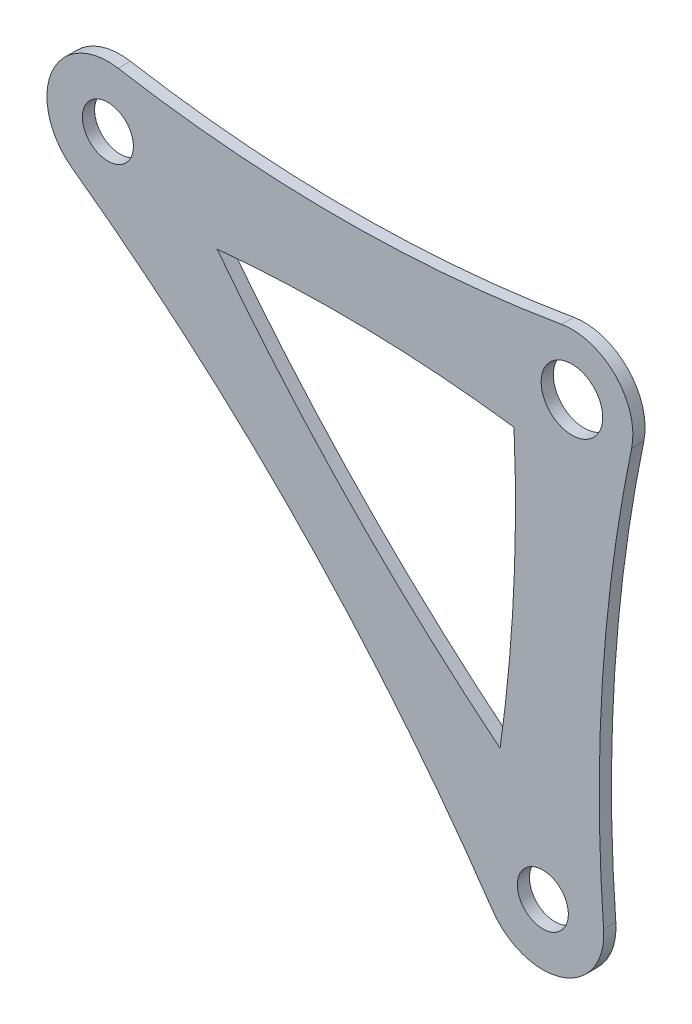
ISO-10303-21;
HEADER;
FILE_DESCRIPTION(('STEP AP214'),'2;1');
FILE_NAME('part.step','',(''),(''),'','','');
FILE_SCHEMA(('AUTOMOTIVE_DESIGN { 1 0 10303 214 1 1 1 1 }'));
ENDSEC;
DATA;
#1=APPLICATION_CONTEXT('core data for automotive mechanical design processes');
#2=APPLICATION_PROTOCOL_DEFINITION('international standard','automotive_design',2000,#1);
#3=PRODUCT_CONTEXT('',#1,'mechanical');
#4=PRODUCT('Part','Part','',(#3));
#5=PRODUCT_RELATED_PRODUCT_CATEGORY('part','',(#4));
#6=PRODUCT_DEFINITION_FORMATION('','',#4);
#7=PRODUCT_DEFINITION_CONTEXT('part definition',#1,'design');
#8=PRODUCT_DEFINITION('design','',#6,#7);
#9=PRODUCT_DEFINITION_SHAPE('','',#8);
#10=(LENGTH_UNIT() NAMED_UNIT(*) SI_UNIT(.MILLI.,.METRE.));
#11=(NAMED_UNIT(*) PLANE_ANGLE_UNIT() SI_UNIT($,.RADIAN.));
#12=(NAMED_UNIT(*) SI_UNIT($,.STERADIAN.) SOLID_ANGLE_UNIT());
#13=UNCERTAINTY_MEASURE_WITH_UNIT(LENGTH_MEASURE(1.E-05),#10,'distance_accuracy_value','');
#14=(GEOMETRIC_REPRESENTATION_CONTEXT(3) GLOBAL_UNCERTAINTY_ASSIGNED_CONTEXT((#13)) GLOBAL_UNIT_ASSIGNED_CONTEXT((#10,
#11,#12)) REPRESENTATION_CONTEXT('',''));
#15=CARTESIAN_POINT('',(0.,0.,0.));
#16=DIRECTION('',(0.,0.,1.));
#17=DIRECTION('',(1.,0.,0.));
#18=AXIS2_PLACEMENT_3D('',#15,#16,#17);
#19=CARTESIAN_POINT('',(-30.03,175.33696472792,-1.58));
#20=DIRECTION('',(0.,0.,1.));
#21=DIRECTION('',(-1.,0.,0.));
#22=AXIS2_PLACEMENT_3D('',#19,#20,#21);
#23=CYLINDRICAL_SURFACE('',#22,170.);
#24=CARTESIAN_POINT('',(-30.03,175.33696472792,0.));
#25=DIRECTION('',(0.,0.,1.));
#26=DIRECTION('',(1.,0.,0.));
#27=AXIS2_PLACEMENT_3D('',#24,#25,#26);
#28=CIRCLE('',#27,170.);
#29=CARTESIAN_POINT('',(-1.33192815785036,7.77676458318788,0.));
#30=VERTEX_POINT('',#29);
#31=CARTESIAN_POINT('',(-58.7280718421496,7.77676458318788,0.));
#32=VERTEX_POINT('',#31);
#33=EDGE_CURVE('E167',#30,#32,#28,.F.);
#34=ORIENTED_EDGE('',*,*,#33,.F.);
#35=DIRECTION('',(0.,0.,1.));
#36=VECTOR('',#35,1.);
#37=CARTESIAN_POINT('',(-1.33192815785036,7.77676458318788,-1.58));
#38=LINE('',#37,#36);
#39=CARTESIAN_POINT('',(-1.33192815785036,7.77676458318788,-1.58));
#40=VERTEX_POINT('',#39);
#41=EDGE_CURVE('E189',#40,#30,#38,.T.);
#42=ORIENTED_EDGE('',*,*,#41,.F.);
#43=CARTESIAN_POINT('',(-30.03,175.33696472792,-1.58));
#44=DIRECTION('',(0.,0.,1.));
#45=DIRECTION('',(1.,0.,0.));
#46=AXIS2_PLACEMENT_3D('',#43,#44,#45);
#47=CIRCLE('',#46,170.);
#48=CARTESIAN_POINT('',(-58.7280718421496,7.77676458318788,-1.58));
#49=VERTEX_POINT('',#48);
#50=EDGE_CURVE('E211',#40,#49,#47,.F.);
#51=ORIENTED_EDGE('',*,*,#50,.T.);
#52=DIRECTION('',(0.,0.,1.));
#53=VECTOR('',#52,1.);
#54=CARTESIAN_POINT('',(-58.7280718421496,7.77676458318788,-1.58));
#55=LINE('',#54,#53);
#56=EDGE_CURVE('E11',#49,#32,#55,.T.);
#57=ORIENTED_EDGE('',*,*,#56,.T.);
#58=EDGE_LOOP('',(#34,#42,#51,#57));
#59=FACE_BOUND('',#58,.T.);
#60=ADVANCED_FACE('F43',(#59),#23,.F.);
#61=CARTESIAN_POINT('',(-60.06,0.,-1.58));
#62=DIRECTION('',(0.,0.,1.));
#63=DIRECTION('',(-1.,0.,0.));
#64=AXIS2_PLACEMENT_3D('',#61,#62,#63);
#65=CYLINDRICAL_SURFACE('',#64,7.89);
#66=CARTESIAN_POINT('',(-60.06,0.,0.));
#67=DIRECTION('',(0.,0.,1.));
#68=DIRECTION('',(1.,0.,0.));
#69=AXIS2_PLACEMENT_3D('',#66,#67,#68);
#70=CIRCLE('',#69,7.89);
#71=CARTESIAN_POINT('',(-64.6781402375793,-6.39725571992014,0.));
#72=VERTEX_POINT('',#71);
#73=EDGE_CURVE('E169',#32,#72,#70,.T.);
#74=ORIENTED_EDGE('',*,*,#73,.F.);
#75=ORIENTED_EDGE('',*,*,#56,.F.);
#76=CARTESIAN_POINT('',(-60.06,0.,-1.58));
#77=DIRECTION('',(0.,0.,1.));
#78=DIRECTION('',(1.,0.,0.));
#79=AXIS2_PLACEMENT_3D('',#76,#77,#78);
#80=CIRCLE('',#79,7.89);
#81=CARTESIAN_POINT('',(-64.6781402375793,-6.39725571992014,-1.58));
#82=VERTEX_POINT('',#81);
#83=EDGE_CURVE('E145',#49,#82,#80,.T.);
#84=ORIENTED_EDGE('',*,*,#83,.T.);
#85=DIRECTION('',(0.,0.,1.));
#86=VECTOR('',#85,1.);
#87=CARTESIAN_POINT('',(-64.6781402375793,-6.39725571992014,-1.58));
#88=LINE('',#87,#86);
#89=EDGE_CURVE('E53',#82,#72,#88,.T.);
#90=ORIENTED_EDGE('',*,*,#89,.T.);
#91=EDGE_LOOP('',(#74,#75,#84,#90));
#92=FACE_BOUND('',#91,.T.);
#93=ADVANCED_FACE('F220',(#92),#65,.T.);
#94=CARTESIAN_POINT('',(-196.374154617217,-188.828502485704,-1.58));
#95=DIRECTION('',(0.,0.,1.));
#96=DIRECTION('',(-1.,0.,0.));
#97=AXIS2_PLACEMENT_3D('',#94,#95,#96);
#98=CYLINDRICAL_SURFACE('',#97,225.);
#99=CARTESIAN_POINT('',(-196.374154617217,-188.828502485704,0.));
#100=DIRECTION('',(0.,0.,1.));
#101=DIRECTION('',(1.,0.,0.));
#102=AXIS2_PLACEMENT_3D('',#99,#100,#101);
#103=CIRCLE('',#102,225.);
#104=CARTESIAN_POINT('',(-10.2923908909579,-62.3430202811258,0.));
#105=VERTEX_POINT('',#104);
#106=EDGE_CURVE('E172',#72,#105,#103,.F.);
#107=ORIENTED_EDGE('',*,*,#106,.F.);
#108=ORIENTED_EDGE('',*,*,#89,.F.);
#109=CARTESIAN_POINT('',(-196.374154617217,-188.828502485704,-1.58));
#110=DIRECTION('',(0.,0.,1.));
#111=DIRECTION('',(1.,0.,0.));
#112=AXIS2_PLACEMENT_3D('',#109,#110,#111);
#113=CIRCLE('',#112,225.);
#114=CARTESIAN_POINT('',(-10.2923908909579,-62.3430202811258,-1.58));
#115=VERTEX_POINT('',#114);
#116=EDGE_CURVE('E143',#82,#115,#113,.F.);
#117=ORIENTED_EDGE('',*,*,#116,.T.);
#118=DIRECTION('',(0.,0.,1.));
#119=VECTOR('',#118,1.);
#120=CARTESIAN_POINT('',(-10.2923908909579,-62.3430202811258,-1.58));
#121=LINE('',#120,#119);
#122=EDGE_CURVE('E137',#115,#105,#121,.T.);
#123=ORIENTED_EDGE('',*,*,#122,.T.);
#124=EDGE_LOOP('',(#107,#108,#117,#123));
#125=FACE_BOUND('',#124,.T.);
#126=ADVANCED_FACE('F224',(#125),#98,.F.);
#127=CARTESIAN_POINT('',(-3.76712370962372,-57.9075960384852,-1.58));
#128=DIRECTION('',(0.,0.,1.));
#129=DIRECTION('',(-1.,0.,0.));
#130=AXIS2_PLACEMENT_3D('',#127,#128,#129);
#131=CYLINDRICAL_SURFACE('',#130,7.89);
#132=CARTESIAN_POINT('',(-3.76712370962372,-57.9075960384852,0.));
#133=DIRECTION('',(0.,0.,1.));
#134=DIRECTION('',(1.,0.,0.));
#135=AXIS2_PLACEMENT_3D('',#132,#133,#134);
#136=CIRCLE('',#135,7.89);
#137=CARTESIAN_POINT('',(4.10065843107563,-57.3159000130698,0.));
#138=VERTEX_POINT('',#137);
#139=EDGE_CURVE('E175',#105,#138,#136,.T.);
#140=ORIENTED_EDGE('',*,*,#139,.F.);
#141=ORIENTED_EDGE('',*,*,#122,.F.);
#142=CARTESIAN_POINT('',(-3.76712370962372,-57.9075960384852,-1.58));
#143=DIRECTION('',(0.,0.,1.));
#144=DIRECTION('',(1.,0.,0.));
#145=AXIS2_PLACEMENT_3D('',#142,#143,#144);
#146=CIRCLE('',#145,7.89);
#147=CARTESIAN_POINT('',(4.10065843107563,-57.3159000130698,-1.58));
#148=VERTEX_POINT('',#147);
#149=EDGE_CURVE('E127',#115,#148,#146,.T.);
#150=ORIENTED_EDGE('',*,*,#149,.T.);
#151=DIRECTION('',(0.,0.,1.));
#152=VECTOR('',#151,1.);
#153=CARTESIAN_POINT('',(4.10065843107563,-57.3159000130698,-1.58));
#154=LINE('',#153,#152);
#155=EDGE_CURVE('E132',#148,#138,#154,.T.);
#156=ORIENTED_EDGE('',*,*,#155,.T.);
#157=EDGE_LOOP('',(#140,#141,#150,#156));
#158=FACE_BOUND('',#157,.T.);
#159=ADVANCED_FACE('F140',(#158),#131,.T.);
#160=CARTESIAN_POINT('',(203.537468081249,-42.317268190119,-1.58));
#161=DIRECTION('',(0.,0.,1.));
#162=DIRECTION('',(-1.,0.,0.));
#163=AXIS2_PLACEMENT_3D('',#160,#161,#162);
#164=CYLINDRICAL_SURFACE('',#163,200.);
#165=CARTESIAN_POINT('',(203.537468081249,-42.317268190119,0.));
#166=DIRECTION('',(0.,0.,1.));
#167=DIRECTION('',(1.,0.,0.));
#168=AXIS2_PLACEMENT_3D('',#165,#166,#167);
#169=CIRCLE('',#168,200.);
#170=CARTESIAN_POINT('',(7.72480938554551,-1.60605727076838,0.));
#171=VERTEX_POINT('',#170);
#172=EDGE_CURVE('E134',#138,#171,#169,.F.);
#173=ORIENTED_EDGE('',*,*,#172,.F.);
#174=ORIENTED_EDGE('',*,*,#155,.F.);
#175=CARTESIAN_POINT('',(203.537468081249,-42.317268190119,-1.58));
#176=DIRECTION('',(0.,0.,1.));
#177=DIRECTION('',(1.,0.,0.));
#178=AXIS2_PLACEMENT_3D('',#175,#176,#177);
#179=CIRCLE('',#178,200.);
#180=CARTESIAN_POINT('',(7.72480938554551,-1.60605727076838,-1.58));
#181=VERTEX_POINT('',#180);
#182=EDGE_CURVE('E122',#148,#181,#179,.F.);
#183=ORIENTED_EDGE('',*,*,#182,.T.);
#184=DIRECTION('',(0.,0.,1.));
#185=VECTOR('',#184,1.);
#186=CARTESIAN_POINT('',(7.72480938554551,-1.60605727076838,-1.58));
#187=LINE('',#186,#185);
#188=EDGE_CURVE('E138',#181,#171,#187,.T.);
#189=ORIENTED_EDGE('',*,*,#188,.T.);
#190=EDGE_LOOP('',(#173,#174,#183,#189));
#191=FACE_BOUND('',#190,.T.);
#192=ADVANCED_FACE('F133',(#191),#164,.F.);
#193=CARTESIAN_POINT('',(132.547030907594,130.920906447219,-1.58));
#194=DIRECTION('',(0.,0.,1.));
#195=DIRECTION('',(-1.,0.,0.));
#196=AXIS2_PLACEMENT_3D('',#193,#194,#195);
#197=CYLINDRICAL_SURFACE('',#196,225.);
#198=CARTESIAN_POINT('',(132.547030907594,130.920906447219,0.));
#199=DIRECTION('',(0.,0.,1.));
#200=DIRECTION('',(1.,0.,0.));
#201=AXIS2_PLACEMENT_3D('',#198,#199,#200);
#202=CIRCLE('',#201,225.);
#203=CARTESIAN_POINT('',(-45.9329006907997,-6.08242933929765,0.));
#204=VERTEX_POINT('',#203);
#205=CARTESIAN_POINT('',(-9.29524167465695,-43.7381033653376,0.));
#206=VERTEX_POINT('',#205);
#207=EDGE_CURVE('E160',#204,#206,#202,.T.);
#208=ORIENTED_EDGE('',*,*,#207,.T.);
#209=DIRECTION('',(0.,0.,1.));
#210=VECTOR('',#209,1.);
#211=CARTESIAN_POINT('',(-9.29524167465695,-43.7381033653376,-1.58));
#212=LINE('',#211,#210);
#213=CARTESIAN_POINT('',(-9.29524167465695,-43.7381033653376,-1.58));
#214=VERTEX_POINT('',#213);
#215=EDGE_CURVE('E159',#214,#206,#212,.T.);
#216=ORIENTED_EDGE('',*,*,#215,.F.);
#217=CARTESIAN_POINT('',(132.547030907594,130.920906447219,-1.58));
#218=DIRECTION('',(0.,0.,1.));
#219=DIRECTION('',(1.,0.,0.));
#220=AXIS2_PLACEMENT_3D('',#217,#218,#219);
#221=CIRCLE('',#220,225.);
#222=CARTESIAN_POINT('',(-45.9329006907997,-6.08242933929765,-1.58));
#223=VERTEX_POINT('',#222);
#224=EDGE_CURVE('E188',#223,#214,#221,.T.);
#225=ORIENTED_EDGE('',*,*,#224,.F.);
#226=DIRECTION('',(0.,0.,1.));
#227=VECTOR('',#226,1.);
#228=CARTESIAN_POINT('',(-45.9329006907997,-6.08242933929765,-1.58));
#229=LINE('',#228,#227);
#230=EDGE_CURVE('E47',#223,#204,#229,.T.);
#231=ORIENTED_EDGE('',*,*,#230,.T.);
#232=EDGE_LOOP('',(#208,#216,#225,#231));
#233=FACE_BOUND('',#232,.T.);
#234=ADVANCED_FACE('F45',(#233),#197,.F.);
#235=CARTESIAN_POINT('',(-30.03,-175.33696472792,-1.58));
#236=DIRECTION('',(0.,0.,1.));
#237=DIRECTION('',(-1.,0.,0.));
#238=AXIS2_PLACEMENT_3D('',#235,#236,#237);
#239=CYLINDRICAL_SURFACE('',#238,170.);
#240=CARTESIAN_POINT('',(-30.03,-175.33696472792,0.));
#241=DIRECTION('',(0.,0.,1.));
#242=DIRECTION('',(1.,0.,0.));
#243=AXIS2_PLACEMENT_3D('',#240,#241,#242);
#244=CIRCLE('',#243,170.);
#245=CARTESIAN_POINT('',(-7.49623434821273,-6.83702583905814,0.));
#246=VERTEX_POINT('',#245);
#247=EDGE_CURVE('E163',#246,#204,#244,.T.);
#248=ORIENTED_EDGE('',*,*,#247,.T.);
#249=ORIENTED_EDGE('',*,*,#230,.F.);
#250=CARTESIAN_POINT('',(-30.03,-175.33696472792,-1.58));
#251=DIRECTION('',(0.,0.,1.));
#252=DIRECTION('',(1.,0.,0.));
#253=AXIS2_PLACEMENT_3D('',#250,#251,#252);
#254=CIRCLE('',#253,170.);
#255=CARTESIAN_POINT('',(-7.49623434821273,-6.83702583905814,-1.58));
#256=VERTEX_POINT('',#255);
#257=EDGE_CURVE('E104',#256,#223,#254,.T.);
#258=ORIENTED_EDGE('',*,*,#257,.F.);
#259=DIRECTION('',(0.,0.,1.));
#260=VECTOR('',#259,1.);
#261=CARTESIAN_POINT('',(-7.49623434821273,-6.83702583905814,-1.58));
#262=LINE('',#261,#260);
#263=EDGE_CURVE('E196',#256,#246,#262,.T.);
#264=ORIENTED_EDGE('',*,*,#263,.T.);
#265=EDGE_LOOP('',(#248,#249,#258,#264));
#266=FACE_BOUND('',#265,.T.);
#267=ADVANCED_FACE('F249',(#266),#239,.F.);
#268=CARTESIAN_POINT('',(0.,0.,-1.58));
#269=DIRECTION('',(0.,0.,1.));
#270=DIRECTION('',(-1.,0.,0.));
#271=AXIS2_PLACEMENT_3D('',#268,#269,#270);
#272=CYLINDRICAL_SURFACE('',#271,3.985);
#273=CARTESIAN_POINT('',(0.,0.,-1.58));
#274=DIRECTION('',(0.,0.,1.));
#275=DIRECTION('',(1.,0.,0.));
#276=AXIS2_PLACEMENT_3D('',#273,#274,#275);
#277=CIRCLE('',#276,3.985);
#278=CARTESIAN_POINT('',(-3.985,0.,-1.58));
#279=VERTEX_POINT('',#278);
#280=EDGE_CURVE('E153',#279,#279,#277,.T.);
#281=CARTESIAN_POINT('',(0.,0.,0.));
#282=DIRECTION('',(0.,0.,1.));
#283=DIRECTION('',(1.,0.,0.));
#284=AXIS2_PLACEMENT_3D('',#281,#282,#283);
#285=CIRCLE('',#284,3.985);
#286=CARTESIAN_POINT('',(-3.985,0.,0.));
#287=VERTEX_POINT('',#286);
#288=EDGE_CURVE('E182',#287,#287,#285,.T.);
#289=CARTESIAN_POINT('',(-3.985,0.,-1.58));
#290=CARTESIAN_POINT('',(-3.985,0.,-1.56354166666667));
#291=CARTESIAN_POINT('',(-3.985,0.,-1.54708333333333));
#292=CARTESIAN_POINT('',(-3.985,0.,-1.51416666666667));
#293=CARTESIAN_POINT('',(-3.985,0.,-1.49770833333333));
#294=CARTESIAN_POINT('',(-3.985,0.,-1.46479166666667));
#295=CARTESIAN_POINT('',(-3.985,0.,-1.44833333333333));
#296=CARTESIAN_POINT('',(-3.985,0.,-1.41541666666667));
#297=CARTESIAN_POINT('',(-3.985,0.,-1.39895833333333));
#298=CARTESIAN_POINT('',(-3.985,0.,-1.36604166666667));
#299=CARTESIAN_POINT('',(-3.985,0.,-1.34958333333333));
#300=CARTESIAN_POINT('',(-3.985,0.,-1.31666666666667));
#301=CARTESIAN_POINT('',(-3.985,0.,-1.30020833333333));
#302=CARTESIAN_POINT('',(-3.985,0.,-1.26729166666667));
#303=CARTESIAN_POINT('',(-3.985,0.,-1.25083333333333));
#304=CARTESIAN_POINT('',(-3.985,0.,-1.21791666666667));
#305=CARTESIAN_POINT('',(-3.985,0.,-1.20145833333333));
#306=CARTESIAN_POINT('',(-3.985,0.,-1.16854166666667));
#307=CARTESIAN_POINT('',(-3.985,0.,-1.15208333333333));
#308=CARTESIAN_POINT('',(-3.985,0.,-1.11916666666667));
#309=CARTESIAN_POINT('',(-3.985,0.,-1.10270833333333));
#310=CARTESIAN_POINT('',(-3.985,0.,-1.06979166666667));
#311=CARTESIAN_POINT('',(-3.985,0.,-1.05333333333333));
#312=CARTESIAN_POINT('',(-3.985,0.,-1.02041666666667));
#313=CARTESIAN_POINT('',(-3.985,0.,-1.00395833333333));
#314=CARTESIAN_POINT('',(-3.985,0.,-0.971041666666667));
#315=CARTESIAN_POINT('',(-3.985,0.,-0.954583333333333));
#316=CARTESIAN_POINT('',(-3.985,0.,-0.921666666666667));
#317=CARTESIAN_POINT('',(-3.985,0.,-0.905208333333333));
#318=CARTESIAN_POINT('',(-3.985,0.,-0.872291666666667));
#319=CARTESIAN_POINT('',(-3.985,0.,-0.855833333333333));
#320=CARTESIAN_POINT('',(-3.985,0.,-0.822916666666667));
#321=CARTESIAN_POINT('',(-3.985,0.,-0.806458333333333));
#322=CARTESIAN_POINT('',(-3.985,0.,-0.773541666666667));
#323=CARTESIAN_POINT('',(-3.985,0.,-0.757083333333333));
#324=CARTESIAN_POINT('',(-3.985,0.,-0.724166666666667));
#325=CARTESIAN_POINT('',(-3.985,0.,-0.707708333333333));
#326=CARTESIAN_POINT('',(-3.985,0.,-0.674791666666667));
#327=CARTESIAN_POINT('',(-3.985,0.,-0.658333333333333));
#328=CARTESIAN_POINT('',(-3.985,0.,-0.625416666666667));
#329=CARTESIAN_POINT('',(-3.985,0.,-0.608958333333333));
#330=CARTESIAN_POINT('',(-3.985,0.,-0.576041666666667));
#331=CARTESIAN_POINT('',(-3.985,0.,-0.559583333333333));
#332=CARTESIAN_POINT('',(-3.985,0.,-0.526666666666667));
#333=CARTESIAN_POINT('',(-3.985,0.,-0.510208333333333));
#334=CARTESIAN_POINT('',(-3.985,0.,-0.477291666666667));
#335=CARTESIAN_POINT('',(-3.985,0.,-0.460833333333333));
#336=CARTESIAN_POINT('',(-3.985,0.,-0.427916666666667));
#337=CARTESIAN_POINT('',(-3.985,0.,-0.411458333333333));
#338=CARTESIAN_POINT('',(-3.985,0.,-0.378541666666667));
#339=CARTESIAN_POINT('',(-3.985,0.,-0.362083333333333));
#340=CARTESIAN_POINT('',(-3.985,0.,-0.329166666666667));
#341=CARTESIAN_POINT('',(-3.985,0.,-0.312708333333333));
#342=CARTESIAN_POINT('',(-3.985,0.,-0.279791666666667));
#343=CARTESIAN_POINT('',(-3.985,0.,-0.263333333333333));
#344=CARTESIAN_POINT('',(-3.985,0.,-0.230416666666667));
#345=CARTESIAN_POINT('',(-3.985,0.,-0.213958333333333));
#346=CARTESIAN_POINT('',(-3.985,0.,-0.181041666666667));
#347=CARTESIAN_POINT('',(-3.985,0.,-0.164583333333333));
#348=CARTESIAN_POINT('',(-3.985,0.,-0.131666666666667));
#349=CARTESIAN_POINT('',(-3.985,0.,-0.115208333333333));
#350=CARTESIAN_POINT('',(-3.985,0.,-0.0822916666666667));
#351=CARTESIAN_POINT('',(-3.985,0.,-0.0658333333333333));
#352=CARTESIAN_POINT('',(-3.985,0.,-0.0329166666666666));
#353=CARTESIAN_POINT('',(-3.985,0.,-0.0164583333333333));
#354=CARTESIAN_POINT('',(-3.985,0.,0.));
#355=B_SPLINE_CURVE_WITH_KNOTS('',3,(#289,#290,#291,#292,#293,#294,#295,#296,#297,#298,#299,
#300,#301,#302,#303,#304,#305,#306,#307,#308,#309,#310,#311,#312,#313,#314,#315,#316,#317,#318,
#319,#320,#321,#322,#323,#324,#325,#326,#327,#328,#329,#330,#331,#332,#333,#334,#335,#336,#337,
#338,#339,#340,#341,#342,#343,#344,#345,#346,#347,#348,#349,#350,#351,#352,#353,#354),
.UNSPECIFIED.,.F.,.F.,(4,2,2,2,2,2,2,2,2,2,2,2,2,2,2,2,2,2,2,2,2,2,2,2,2,2,2,2,2,2,2,2,4),(0.,
0.0493750000000002,0.0987500000000001,0.148125,0.1975,0.246875,0.29625,0.345625,0.395,0.444375,
0.49375,0.543125,0.5925,0.641875,0.69125,0.740625,0.79,0.839375,0.88875,0.938125,0.9875,
1.036875,1.08625,1.135625,1.185,1.234375,1.28375,1.333125,1.3825,1.431875,1.48125,1.530625,
1.58),.UNSPECIFIED.);
#356=EDGE_CURVE('BSEAM238',#279,#287,#355,.T.);
#357=ORIENTED_EDGE('',*,*,#280,.F.);
#358=ORIENTED_EDGE('',*,*,#288,.T.);
#359=ORIENTED_EDGE('',*,*,#356,.T.);
#360=ORIENTED_EDGE('',*,*,#356,.F.);
#361=EDGE_LOOP('',(#357,#359,#358,#360));
#362=FACE_BOUND('',#361,.T.);
#363=ADVANCED_FACE('F238',(#362),#272,.F.);
#364=CARTESIAN_POINT('',(-3.76712370962372,-57.9075960384852,-1.58));
#365=DIRECTION('',(0.,0.,1.));
#366=DIRECTION('',(-1.,0.,0.));
#367=AXIS2_PLACEMENT_3D('',#364,#365,#366);
#368=CYLINDRICAL_SURFACE('',#367,3.30000000000001);
#369=CARTESIAN_POINT('',(-3.76712370962372,-57.9075960384852,-1.58));
#370=DIRECTION('',(0.,0.,1.));
#371=DIRECTION('',(1.,0.,0.));
#372=AXIS2_PLACEMENT_3D('',#369,#370,#371);
#373=CIRCLE('',#372,3.30000000000001);
#374=CARTESIAN_POINT('',(-7.06712370962372,-57.9075960384852,-1.58));
#375=VERTEX_POINT('',#374);
#376=EDGE_CURVE('E150',#375,#375,#373,.T.);
#377=CARTESIAN_POINT('',(-3.76712370962372,-57.9075960384852,0.));
#378=DIRECTION('',(0.,0.,1.));
#379=DIRECTION('',(1.,0.,0.));
#380=AXIS2_PLACEMENT_3D('',#377,#378,#379);
#381=CIRCLE('',#380,3.30000000000001);
#382=CARTESIAN_POINT('',(-7.06712370962372,-57.9075960384852,0.));
#383=VERTEX_POINT('',#382);
#384=EDGE_CURVE('E179',#383,#383,#381,.T.);
#385=CARTESIAN_POINT('',(-7.06712370962372,-57.9075960384852,-1.58));
#386=CARTESIAN_POINT('',(-7.06712370962372,-57.9075960384852,-1.56354166666667));
#387=CARTESIAN_POINT('',(-7.06712370962372,-57.9075960384852,-1.54708333333333));
#388=CARTESIAN_POINT('',(-7.06712370962372,-57.9075960384852,-1.51416666666667));
#389=CARTESIAN_POINT('',(-7.06712370962372,-57.9075960384852,-1.49770833333333));
#390=CARTESIAN_POINT('',(-7.06712370962372,-57.9075960384852,-1.46479166666667));
#391=CARTESIAN_POINT('',(-7.06712370962372,-57.9075960384852,-1.44833333333333));
#392=CARTESIAN_POINT('',(-7.06712370962372,-57.9075960384852,-1.41541666666667));
#393=CARTESIAN_POINT('',(-7.06712370962372,-57.9075960384852,-1.39895833333333));
#394=CARTESIAN_POINT('',(-7.06712370962372,-57.9075960384852,-1.36604166666667));
#395=CARTESIAN_POINT('',(-7.06712370962372,-57.9075960384852,-1.34958333333333));
#396=CARTESIAN_POINT('',(-7.06712370962372,-57.9075960384852,-1.31666666666667));
#397=CARTESIAN_POINT('',(-7.06712370962372,-57.9075960384852,-1.30020833333333));
#398=CARTESIAN_POINT('',(-7.06712370962372,-57.9075960384852,-1.26729166666667));
#399=CARTESIAN_POINT('',(-7.06712370962372,-57.9075960384852,-1.25083333333333));
#400=CARTESIAN_POINT('',(-7.06712370962372,-57.9075960384852,-1.21791666666667));
#401=CARTESIAN_POINT('',(-7.06712370962372,-57.9075960384852,-1.20145833333333));
#402=CARTESIAN_POINT('',(-7.06712370962372,-57.9075960384852,-1.16854166666667));
#403=CARTESIAN_POINT('',(-7.06712370962372,-57.9075960384852,-1.15208333333333));
#404=CARTESIAN_POINT('',(-7.06712370962372,-57.9075960384852,-1.11916666666667));
#405=CARTESIAN_POINT('',(-7.06712370962372,-57.9075960384852,-1.10270833333333));
#406=CARTESIAN_POINT('',(-7.06712370962372,-57.9075960384852,-1.06979166666667));
#407=CARTESIAN_POINT('',(-7.06712370962372,-57.9075960384852,-1.05333333333333));
#408=CARTESIAN_POINT('',(-7.06712370962372,-57.9075960384852,-1.02041666666667));
#409=CARTESIAN_POINT('',(-7.06712370962372,-57.9075960384852,-1.00395833333333));
#410=CARTESIAN_POINT('',(-7.06712370962372,-57.9075960384852,-0.971041666666667));
#411=CARTESIAN_POINT('',(-7.06712370962372,-57.9075960384852,-0.954583333333333));
#412=CARTESIAN_POINT('',(-7.06712370962372,-57.9075960384852,-0.921666666666667));
#413=CARTESIAN_POINT('',(-7.06712370962372,-57.9075960384852,-0.905208333333333));
#414=CARTESIAN_POINT('',(-7.06712370962372,-57.9075960384852,-0.872291666666667));
#415=CARTESIAN_POINT('',(-7.06712370962372,-57.9075960384852,-0.855833333333333));
#416=CARTESIAN_POINT('',(-7.06712370962372,-57.9075960384852,-0.822916666666667));
#417=CARTESIAN_POINT('',(-7.06712370962372,-57.9075960384852,-0.806458333333333));
#418=CARTESIAN_POINT('',(-7.06712370962372,-57.9075960384852,-0.773541666666667));
#419=CARTESIAN_POINT('',(-7.06712370962372,-57.9075960384852,-0.757083333333333));
#420=CARTESIAN_POINT('',(-7.06712370962372,-57.9075960384852,-0.724166666666667));
#421=CARTESIAN_POINT('',(-7.06712370962372,-57.9075960384852,-0.707708333333333));
#422=CARTESIAN_POINT('',(-7.06712370962372,-57.9075960384852,-0.674791666666667));
#423=CARTESIAN_POINT('',(-7.06712370962372,-57.9075960384852,-0.658333333333333));
#424=CARTESIAN_POINT('',(-7.06712370962372,-57.9075960384852,-0.625416666666667));
#425=CARTESIAN_POINT('',(-7.06712370962372,-57.9075960384852,-0.608958333333333));
#426=CARTESIAN_POINT('',(-7.06712370962372,-57.9075960384852,-0.576041666666667));
#427=CARTESIAN_POINT('',(-7.06712370962372,-57.9075960384852,-0.559583333333333));
#428=CARTESIAN_POINT('',(-7.06712370962372,-57.9075960384852,-0.526666666666667));
#429=CARTESIAN_POINT('',(-7.06712370962372,-57.9075960384852,-0.510208333333333));
#430=CARTESIAN_POINT('',(-7.06712370962372,-57.9075960384852,-0.477291666666667));
#431=CARTESIAN_POINT('',(-7.06712370962372,-57.9075960384852,-0.460833333333333));
#432=CARTESIAN_POINT('',(-7.06712370962372,-57.9075960384852,-0.427916666666667));
#433=CARTESIAN_POINT('',(-7.06712370962372,-57.9075960384852,-0.411458333333333));
#434=CARTESIAN_POINT('',(-7.06712370962372,-57.9075960384852,-0.378541666666667));
#435=CARTESIAN_POINT('',(-7.06712370962372,-57.9075960384852,-0.362083333333333));
#436=CARTESIAN_POINT('',(-7.06712370962372,-57.9075960384852,-0.329166666666667));
#437=CARTESIAN_POINT('',(-7.06712370962372,-57.9075960384852,-0.312708333333333));
#438=CARTESIAN_POINT('',(-7.06712370962372,-57.9075960384852,-0.279791666666667));
#439=CARTESIAN_POINT('',(-7.06712370962372,-57.9075960384852,-0.263333333333333));
#440=CARTESIAN_POINT('',(-7.06712370962372,-57.9075960384852,-0.230416666666667));
#441=CARTESIAN_POINT('',(-7.06712370962372,-57.9075960384852,-0.213958333333333));
#442=CARTESIAN_POINT('',(-7.06712370962372,-57.9075960384852,-0.181041666666667));
#443=CARTESIAN_POINT('',(-7.06712370962372,-57.9075960384852,-0.164583333333333));
#444=CARTESIAN_POINT('',(-7.06712370962372,-57.9075960384852,-0.131666666666667));
#445=CARTESIAN_POINT('',(-7.06712370962372,-57.9075960384852,-0.115208333333333));
#446=CARTESIAN_POINT('',(-7.06712370962372,-57.9075960384852,-0.0822916666666667));
#447=CARTESIAN_POINT('',(-7.06712370962372,-57.9075960384852,-0.0658333333333333));
#448=CARTESIAN_POINT('',(-7.06712370962372,-57.9075960384852,-0.0329166666666666));
#449=CARTESIAN_POINT('',(-7.06712370962372,-57.9075960384852,-0.0164583333333333));
#450=CARTESIAN_POINT('',(-7.06712370962372,-57.9075960384852,0.));
#451=B_SPLINE_CURVE_WITH_KNOTS('',3,(#385,#386,#387,#388,#389,#390,#391,#392,#393,#394,#395,
#396,#397,#398,#399,#400,#401,#402,#403,#404,#405,#406,#407,#408,#409,#410,#411,#412,#413,#414,
#415,#416,#417,#418,#419,#420,#421,#422,#423,#424,#425,#426,#427,#428,#429,#430,#431,#432,#433,
#434,#435,#436,#437,#438,#439,#440,#441,#442,#443,#444,#445,#446,#447,#448,#449,#450),
.UNSPECIFIED.,.F.,.F.,(4,2,2,2,2,2,2,2,2,2,2,2,2,2,2,2,2,2,2,2,2,2,2,2,2,2,2,2,2,2,2,2,4),(0.,
0.0493750000000002,0.0987500000000001,0.148125,0.1975,0.246875,0.29625,0.345625,0.395,0.444375,
0.49375,0.543125,0.5925,0.641875,0.69125,0.740625,0.79,0.839375,0.88875,0.938125,0.9875,
1.036875,1.08625,1.135625,1.185,1.234375,1.28375,1.333125,1.3825,1.431875,1.48125,1.530625,
1.58),.UNSPECIFIED.);
#452=EDGE_CURVE('BSEAM230',#375,#383,#451,.T.);
#453=ORIENTED_EDGE('',*,*,#376,.F.);
#454=ORIENTED_EDGE('',*,*,#384,.T.);
#455=ORIENTED_EDGE('',*,*,#452,.T.);
#456=ORIENTED_EDGE('',*,*,#452,.F.);
#457=EDGE_LOOP('',(#453,#455,#454,#456));
#458=FACE_BOUND('',#457,.T.);
#459=ADVANCED_FACE('F230',(#458),#368,.F.);
#460=CARTESIAN_POINT('',(0.,0.,-1.58));
#461=DIRECTION('',(0.,0.,1.));
#462=DIRECTION('',(-1.,0.,0.));
#463=AXIS2_PLACEMENT_3D('',#460,#461,#462);
#464=CYLINDRICAL_SURFACE('',#463,7.89);
#465=CARTESIAN_POINT('',(0.,0.,0.));
#466=DIRECTION('',(0.,0.,1.));
#467=DIRECTION('',(1.,0.,0.));
#468=AXIS2_PLACEMENT_3D('',#465,#466,#467);
#469=CIRCLE('',#468,7.89);
#470=EDGE_CURVE('E91',#171,#30,#469,.T.);
#471=ORIENTED_EDGE('',*,*,#470,.F.);
#472=ORIENTED_EDGE('',*,*,#188,.F.);
#473=CARTESIAN_POINT('',(0.,0.,-1.58));
#474=DIRECTION('',(0.,0.,1.));
#475=DIRECTION('',(1.,0.,0.));
#476=AXIS2_PLACEMENT_3D('',#473,#474,#475);
#477=CIRCLE('',#476,7.89);
#478=EDGE_CURVE('E62',#181,#40,#477,.T.);
#479=ORIENTED_EDGE('',*,*,#478,.T.);
#480=ORIENTED_EDGE('',*,*,#41,.T.);
#481=EDGE_LOOP('',(#471,#472,#479,#480));
#482=FACE_BOUND('',#481,.T.);
#483=ADVANCED_FACE('F228',(#482),#464,.T.);
#484=CARTESIAN_POINT('',(-207.304591790873,-15.5903278483662,-1.58));
#485=DIRECTION('',(0.,0.,1.));
#486=DIRECTION('',(-1.,0.,0.));
#487=AXIS2_PLACEMENT_3D('',#484,#485,#486);
#488=CYLINDRICAL_SURFACE('',#487,200.);
#489=CARTESIAN_POINT('',(-207.304591790873,-15.5903278483662,0.));
#490=DIRECTION('',(0.,0.,1.));
#491=DIRECTION('',(1.,0.,0.));
#492=AXIS2_PLACEMENT_3D('',#489,#490,#491);
#493=CIRCLE('',#492,200.);
#494=EDGE_CURVE('E165',#206,#246,#493,.T.);
#495=ORIENTED_EDGE('',*,*,#494,.T.);
#496=ORIENTED_EDGE('',*,*,#263,.F.);
#497=CARTESIAN_POINT('',(-207.304591790873,-15.5903278483662,-1.58));
#498=DIRECTION('',(0.,0.,1.));
#499=DIRECTION('',(1.,0.,0.));
#500=AXIS2_PLACEMENT_3D('',#497,#498,#499);
#501=CIRCLE('',#500,200.);
#502=EDGE_CURVE('E210',#214,#256,#501,.T.);
#503=ORIENTED_EDGE('',*,*,#502,.F.);
#504=ORIENTED_EDGE('',*,*,#215,.T.);
#505=EDGE_LOOP('',(#495,#496,#503,#504));
#506=FACE_BOUND('',#505,.T.);
#507=ADVANCED_FACE('F209',(#506),#488,.F.);
#508=CARTESIAN_POINT('',(-60.06,0.,-1.58));
#509=DIRECTION('',(0.,0.,1.));
#510=DIRECTION('',(-1.,0.,0.));
#511=AXIS2_PLACEMENT_3D('',#508,#509,#510);
#512=CYLINDRICAL_SURFACE('',#511,3.3);
#513=CARTESIAN_POINT('',(-60.06,0.,-1.58));
#514=DIRECTION('',(0.,0.,1.));
#515=DIRECTION('',(1.,0.,0.));
#516=AXIS2_PLACEMENT_3D('',#513,#514,#515);
#517=CIRCLE('',#516,3.3);
#518=CARTESIAN_POINT('',(-63.36,0.,-1.58));
#519=VERTEX_POINT('',#518);
#520=EDGE_CURVE('E156',#519,#519,#517,.T.);
#521=CARTESIAN_POINT('',(-60.06,0.,0.));
#522=DIRECTION('',(0.,0.,1.));
#523=DIRECTION('',(1.,0.,0.));
#524=AXIS2_PLACEMENT_3D('',#521,#522,#523);
#525=CIRCLE('',#524,3.3);
#526=CARTESIAN_POINT('',(-63.36,0.,0.));
#527=VERTEX_POINT('',#526);
#528=EDGE_CURVE('E185',#527,#527,#525,.T.);
#529=CARTESIAN_POINT('',(-63.36,0.,-1.58));
#530=CARTESIAN_POINT('',(-63.36,0.,-1.56354166666667));
#531=CARTESIAN_POINT('',(-63.36,0.,-1.54708333333333));
#532=CARTESIAN_POINT('',(-63.36,0.,-1.51416666666667));
#533=CARTESIAN_POINT('',(-63.36,0.,-1.49770833333333));
#534=CARTESIAN_POINT('',(-63.36,0.,-1.46479166666667));
#535=CARTESIAN_POINT('',(-63.36,0.,-1.44833333333333));
#536=CARTESIAN_POINT('',(-63.36,0.,-1.41541666666667));
#537=CARTESIAN_POINT('',(-63.36,0.,-1.39895833333333));
#538=CARTESIAN_POINT('',(-63.36,0.,-1.36604166666667));
#539=CARTESIAN_POINT('',(-63.36,0.,-1.34958333333333));
#540=CARTESIAN_POINT('',(-63.36,0.,-1.31666666666667));
#541=CARTESIAN_POINT('',(-63.36,0.,-1.30020833333333));
#542=CARTESIAN_POINT('',(-63.36,0.,-1.26729166666667));
#543=CARTESIAN_POINT('',(-63.36,0.,-1.25083333333333));
#544=CARTESIAN_POINT('',(-63.36,0.,-1.21791666666667));
#545=CARTESIAN_POINT('',(-63.36,0.,-1.20145833333333));
#546=CARTESIAN_POINT('',(-63.36,0.,-1.16854166666667));
#547=CARTESIAN_POINT('',(-63.36,0.,-1.15208333333333));
#548=CARTESIAN_POINT('',(-63.36,0.,-1.11916666666667));
#549=CARTESIAN_POINT('',(-63.36,0.,-1.10270833333333));
#550=CARTESIAN_POINT('',(-63.36,0.,-1.06979166666667));
#551=CARTESIAN_POINT('',(-63.36,0.,-1.05333333333333));
#552=CARTESIAN_POINT('',(-63.36,0.,-1.02041666666667));
#553=CARTESIAN_POINT('',(-63.36,0.,-1.00395833333333));
#554=CARTESIAN_POINT('',(-63.36,0.,-0.971041666666667));
#555=CARTESIAN_POINT('',(-63.36,0.,-0.954583333333333));
#556=CARTESIAN_POINT('',(-63.36,0.,-0.921666666666667));
#557=CARTESIAN_POINT('',(-63.36,0.,-0.905208333333333));
#558=CARTESIAN_POINT('',(-63.36,0.,-0.872291666666667));
#559=CARTESIAN_POINT('',(-63.36,0.,-0.855833333333333));
#560=CARTESIAN_POINT('',(-63.36,0.,-0.822916666666667));
#561=CARTESIAN_POINT('',(-63.36,0.,-0.806458333333333));
#562=CARTESIAN_POINT('',(-63.36,0.,-0.773541666666667));
#563=CARTESIAN_POINT('',(-63.36,0.,-0.757083333333333));
#564=CARTESIAN_POINT('',(-63.36,0.,-0.724166666666667));
#565=CARTESIAN_POINT('',(-63.36,0.,-0.707708333333333));
#566=CARTESIAN_POINT('',(-63.36,0.,-0.674791666666667));
#567=CARTESIAN_POINT('',(-63.36,0.,-0.658333333333333));
#568=CARTESIAN_POINT('',(-63.36,0.,-0.625416666666667));
#569=CARTESIAN_POINT('',(-63.36,0.,-0.608958333333333));
#570=CARTESIAN_POINT('',(-63.36,0.,-0.576041666666667));
#571=CARTESIAN_POINT('',(-63.36,0.,-0.559583333333333));
#572=CARTESIAN_POINT('',(-63.36,0.,-0.526666666666667));
#573=CARTESIAN_POINT('',(-63.36,0.,-0.510208333333333));
#574=CARTESIAN_POINT('',(-63.36,0.,-0.477291666666667));
#575=CARTESIAN_POINT('',(-63.36,0.,-0.460833333333333));
#576=CARTESIAN_POINT('',(-63.36,0.,-0.427916666666667));
#577=CARTESIAN_POINT('',(-63.36,0.,-0.411458333333333));
#578=CARTESIAN_POINT('',(-63.36,0.,-0.378541666666667));
#579=CARTESIAN_POINT('',(-63.36,0.,-0.362083333333333));
#580=CARTESIAN_POINT('',(-63.36,0.,-0.329166666666667));
#581=CARTESIAN_POINT('',(-63.36,0.,-0.312708333333333));
#582=CARTESIAN_POINT('',(-63.36,0.,-0.279791666666667));
#583=CARTESIAN_POINT('',(-63.36,0.,-0.263333333333333));
#584=CARTESIAN_POINT('',(-63.36,0.,-0.230416666666667));
#585=CARTESIAN_POINT('',(-63.36,0.,-0.213958333333333));
#586=CARTESIAN_POINT('',(-63.36,0.,-0.181041666666667));
#587=CARTESIAN_POINT('',(-63.36,0.,-0.164583333333333));
#588=CARTESIAN_POINT('',(-63.36,0.,-0.131666666666667));
#589=CARTESIAN_POINT('',(-63.36,0.,-0.115208333333333));
#590=CARTESIAN_POINT('',(-63.36,0.,-0.0822916666666667));
#591=CARTESIAN_POINT('',(-63.36,0.,-0.0658333333333333));
#592=CARTESIAN_POINT('',(-63.36,0.,-0.0329166666666666));
#593=CARTESIAN_POINT('',(-63.36,0.,-0.0164583333333333));
#594=CARTESIAN_POINT('',(-63.36,0.,0.));
#595=B_SPLINE_CURVE_WITH_KNOTS('',3,(#529,#530,#531,#532,#533,#534,#535,#536,#537,#538,#539,
#540,#541,#542,#543,#544,#545,#546,#547,#548,#549,#550,#551,#552,#553,#554,#555,#556,#557,#558,
#559,#560,#561,#562,#563,#564,#565,#566,#567,#568,#569,#570,#571,#572,#573,#574,#575,#576,#577,
#578,#579,#580,#581,#582,#583,#584,#585,#586,#587,#588,#589,#590,#591,#592,#593,#594),
.UNSPECIFIED.,.F.,.F.,(4,2,2,2,2,2,2,2,2,2,2,2,2,2,2,2,2,2,2,2,2,2,2,2,2,2,2,2,2,2,2,2,4),(0.,
0.0493750000000002,0.0987500000000001,0.148125,0.1975,0.246875,0.29625,0.345625,0.395,0.444375,
0.49375,0.543125,0.5925,0.641875,0.69125,0.740625,0.79,0.839375,0.88875,0.938125,0.9875,
1.036875,1.08625,1.135625,1.185,1.234375,1.28375,1.333125,1.3825,1.431875,1.48125,1.530625,
1.58),.UNSPECIFIED.);
#596=EDGE_CURVE('BSEAM236',#519,#527,#595,.T.);
#597=ORIENTED_EDGE('',*,*,#520,.F.);
#598=ORIENTED_EDGE('',*,*,#528,.T.);
#599=ORIENTED_EDGE('',*,*,#596,.T.);
#600=ORIENTED_EDGE('',*,*,#596,.F.);
#601=EDGE_LOOP('',(#597,#599,#598,#600));
#602=FACE_BOUND('',#601,.T.);
#603=ADVANCED_FACE('F236',(#602),#512,.F.);
#604=CARTESIAN_POINT('',(0.,0.,-1.58));
#605=DIRECTION('',(0.,0.,-1.));
#606=DIRECTION('',(1.,0.,0.));
#607=AXIS2_PLACEMENT_3D('',#604,#605,#606);
#608=PLANE('',#607);
#609=ORIENTED_EDGE('',*,*,#224,.T.);
#610=ORIENTED_EDGE('',*,*,#502,.T.);
#611=ORIENTED_EDGE('',*,*,#257,.T.);
#612=EDGE_LOOP('',(#609,#610,#611));
#613=FACE_BOUND('',#612,.T.);
#614=ORIENTED_EDGE('',*,*,#50,.F.);
#615=ORIENTED_EDGE('',*,*,#478,.F.);
#616=ORIENTED_EDGE('',*,*,#182,.F.);
#617=ORIENTED_EDGE('',*,*,#149,.F.);
#618=ORIENTED_EDGE('',*,*,#116,.F.);
#619=ORIENTED_EDGE('',*,*,#83,.F.);
#620=EDGE_LOOP('',(#614,#615,#616,#617,#618,#619));
#621=FACE_BOUND('',#620,.T.);
#622=ORIENTED_EDGE('',*,*,#376,.T.);
#623=EDGE_LOOP('',(#622));
#624=FACE_BOUND('',#623,.T.);
#625=ORIENTED_EDGE('',*,*,#280,.T.);
#626=EDGE_LOOP('',(#625));
#627=FACE_BOUND('',#626,.T.);
#628=ORIENTED_EDGE('',*,*,#520,.T.);
#629=EDGE_LOOP('',(#628));
#630=FACE_BOUND('',#629,.T.);
#631=ADVANCED_FACE('F124',(#613,#621,#624,#627,#630),#608,.T.);
#632=CARTESIAN_POINT('',(0.,0.,0.));
#633=DIRECTION('',(0.,0.,-1.));
#634=DIRECTION('',(1.,0.,0.));
#635=AXIS2_PLACEMENT_3D('',#632,#633,#634);
#636=PLANE('',#635);
#637=ORIENTED_EDGE('',*,*,#207,.F.);
#638=ORIENTED_EDGE('',*,*,#247,.F.);
#639=ORIENTED_EDGE('',*,*,#494,.F.);
#640=EDGE_LOOP('',(#637,#638,#639));
#641=FACE_BOUND('',#640,.T.);
#642=ORIENTED_EDGE('',*,*,#33,.T.);
#643=ORIENTED_EDGE('',*,*,#73,.T.);
#644=ORIENTED_EDGE('',*,*,#106,.T.);
#645=ORIENTED_EDGE('',*,*,#139,.T.);
#646=ORIENTED_EDGE('',*,*,#172,.T.);
#647=ORIENTED_EDGE('',*,*,#470,.T.);
#648=EDGE_LOOP('',(#642,#643,#644,#645,#646,#647));
#649=FACE_BOUND('',#648,.T.);
#650=ORIENTED_EDGE('',*,*,#384,.F.);
#651=EDGE_LOOP('',(#650));
#652=FACE_BOUND('',#651,.T.);
#653=ORIENTED_EDGE('',*,*,#288,.F.);
#654=EDGE_LOOP('',(#653));
#655=FACE_BOUND('',#654,.T.);
#656=ORIENTED_EDGE('',*,*,#528,.F.);
#657=EDGE_LOOP('',(#656));
#658=FACE_BOUND('',#657,.T.);
#659=ADVANCED_FACE('F207',(#641,#649,#652,#655,#658),#636,.F.);
#660=CLOSED_SHELL('',(#60,#93,#126,#159,#192,#234,#267,#363,#459,#483,#507,#603,#631,#659));
#661=MANIFOLD_SOLID_BREP('B2',#660);
#662=ADVANCED_BREP_SHAPE_REPRESENTATION('',(#18,#661),#14);
#663=SHAPE_DEFINITION_REPRESENTATION(#9,#662);
ENDSEC;
END-ISO-10303-21;
